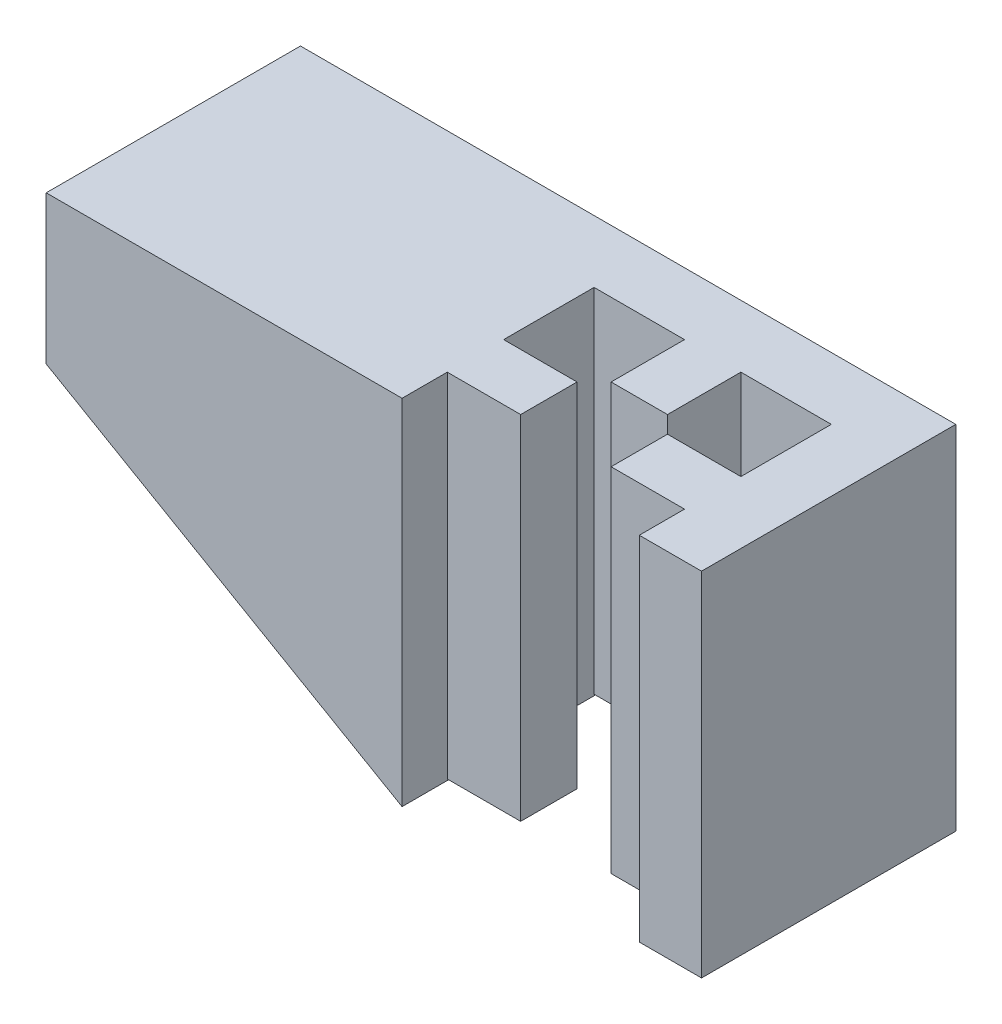
ISO-10303-21;
HEADER;
FILE_DESCRIPTION(('STEP AP214'),'2;1');
FILE_NAME('part.step','',(''),(''),'','','');
FILE_SCHEMA(('AUTOMOTIVE_DESIGN { 1 0 10303 214 1 1 1 1 }'));
ENDSEC;
DATA;
#1=APPLICATION_CONTEXT('core data for automotive mechanical design processes');
#2=APPLICATION_PROTOCOL_DEFINITION('international standard','automotive_design',2000,#1);
#3=PRODUCT_CONTEXT('',#1,'mechanical');
#4=PRODUCT('Part','Part','',(#3));
#5=PRODUCT_RELATED_PRODUCT_CATEGORY('part','',(#4));
#6=PRODUCT_DEFINITION_FORMATION('','',#4);
#7=PRODUCT_DEFINITION_CONTEXT('part definition',#1,'design');
#8=PRODUCT_DEFINITION('design','',#6,#7);
#9=PRODUCT_DEFINITION_SHAPE('','',#8);
#10=(LENGTH_UNIT() NAMED_UNIT(*) SI_UNIT(.MILLI.,.METRE.));
#11=(NAMED_UNIT(*) PLANE_ANGLE_UNIT() SI_UNIT($,.RADIAN.));
#12=(NAMED_UNIT(*) SI_UNIT($,.STERADIAN.) SOLID_ANGLE_UNIT());
#13=UNCERTAINTY_MEASURE_WITH_UNIT(LENGTH_MEASURE(1.E-05),#10,'distance_accuracy_value','');
#14=(GEOMETRIC_REPRESENTATION_CONTEXT(3) GLOBAL_UNCERTAINTY_ASSIGNED_CONTEXT((#13)) GLOBAL_UNIT_ASSIGNED_CONTEXT((#10,
#11,#12)) REPRESENTATION_CONTEXT('',''));
#15=CARTESIAN_POINT('',(0.,0.,0.));
#16=DIRECTION('',(0.,0.,1.));
#17=DIRECTION('',(1.,0.,0.));
#18=AXIS2_PLACEMENT_3D('',#15,#16,#17);
#19=CARTESIAN_POINT('',(-15.4,15.,-15.4));
#20=DIRECTION('',(0.,0.,1.));
#21=DIRECTION('',(1.,0.,0.));
#22=AXIS2_PLACEMENT_3D('',#19,#20,#21);
#23=PLANE('',#22);
#24=DIRECTION('',(0.866025403784436,-0.500000000000004,0.));
#25=VECTOR('',#24,1.);
#26=CARTESIAN_POINT('',(-27.1153998019124,-5.29166768789439,-15.4));
#27=LINE('',#26,#25);
#28=CARTESIAN_POINT('',(-40.4,2.37819981254814,-15.4));
#29=VERTEX_POINT('',#28);
#30=CARTESIAN_POINT('',(-10.1,-15.1155133438977,-15.4));
#31=VERTEX_POINT('',#30);
#32=EDGE_CURVE('E48',#29,#31,#27,.T.);
#33=ORIENTED_EDGE('',*,*,#32,.F.);
#34=DIRECTION('',(0.,-1.,0.));
#35=VECTOR('',#34,1.);
#36=CARTESIAN_POINT('',(-40.4,15.,-15.4));
#37=LINE('',#36,#35);
#38=CARTESIAN_POINT('',(-40.4,15.,-15.4));
#39=VERTEX_POINT('',#38);
#40=EDGE_CURVE('E205',#39,#29,#37,.T.);
#41=ORIENTED_EDGE('',*,*,#40,.F.);
#42=DIRECTION('',(-1.,0.,0.));
#43=VECTOR('',#42,1.);
#44=CARTESIAN_POINT('',(-15.4,15.,-15.4));
#45=LINE('',#44,#43);
#46=CARTESIAN_POINT('',(15.4,15.,-15.4));
#47=VERTEX_POINT('',#46);
#48=EDGE_CURVE('E247',#47,#39,#45,.T.);
#49=ORIENTED_EDGE('',*,*,#48,.F.);
#50=DIRECTION('',(0.,-1.,0.));
#51=VECTOR('',#50,1.);
#52=CARTESIAN_POINT('',(15.4,15.,-15.4));
#53=LINE('',#52,#51);
#54=CARTESIAN_POINT('',(15.4,-15.,-15.4));
#55=VERTEX_POINT('',#54);
#56=EDGE_CURVE('E291',#47,#55,#53,.T.);
#57=ORIENTED_EDGE('',*,*,#56,.T.);
#58=DIRECTION('',(-1.,0.,0.));
#59=VECTOR('',#58,1.);
#60=CARTESIAN_POINT('',(-15.4,-15.,-15.4));
#61=LINE('',#60,#59);
#62=CARTESIAN_POINT('',(-10.1,-15.,-15.4));
#63=VERTEX_POINT('',#62);
#64=EDGE_CURVE('E217',#55,#63,#61,.T.);
#65=ORIENTED_EDGE('',*,*,#64,.T.);
#66=DIRECTION('',(0.,1.,0.));
#67=VECTOR('',#66,1.);
#68=CARTESIAN_POINT('',(-10.1,-40.,-15.4));
#69=LINE('',#68,#67);
#70=EDGE_CURVE('E203',#31,#63,#69,.T.);
#71=ORIENTED_EDGE('',*,*,#70,.F.);
#72=EDGE_LOOP('',(#33,#41,#49,#57,#65,#71));
#73=FACE_BOUND('',#72,.T.);
#74=ADVANCED_FACE('F33',(#73),#23,.F.);
#75=CARTESIAN_POINT('',(-10.1,15.,6.25));
#76=DIRECTION('',(0.,0.,-1.));
#77=DIRECTION('',(-1.,0.,0.));
#78=AXIS2_PLACEMENT_3D('',#75,#76,#77);
#79=PLANE('',#78);
#80=DIRECTION('',(-0.866025403784436,0.500000000000004,0.));
#81=VECTOR('',#80,1.);
#82=CARTESIAN_POINT('',(-23.1403998019124,-7.58663500792316,6.25));
#83=LINE('',#82,#81);
#84=CARTESIAN_POINT('',(-10.1,-15.1155133438977,6.25));
#85=VERTEX_POINT('',#84);
#86=CARTESIAN_POINT('',(-40.4,2.37819981254814,6.25000000000001));
#87=VERTEX_POINT('',#86);
#88=EDGE_CURVE('E11',#85,#87,#83,.T.);
#89=ORIENTED_EDGE('',*,*,#88,.F.);
#90=DIRECTION('',(0.,-1.,0.));
#91=VECTOR('',#90,1.);
#92=CARTESIAN_POINT('',(-10.1,15.,6.25));
#93=LINE('',#92,#91);
#94=CARTESIAN_POINT('',(-10.1,15.,6.25));
#95=VERTEX_POINT('',#94);
#96=EDGE_CURVE('E289',#95,#85,#93,.T.);
#97=ORIENTED_EDGE('',*,*,#96,.F.);
#98=DIRECTION('',(1.,0.,0.));
#99=VECTOR('',#98,1.);
#100=CARTESIAN_POINT('',(-10.1,15.,6.25));
#101=LINE('',#100,#99);
#102=CARTESIAN_POINT('',(-40.4,15.,6.25));
#103=VERTEX_POINT('',#102);
#104=EDGE_CURVE('E249',#103,#95,#101,.T.);
#105=ORIENTED_EDGE('',*,*,#104,.F.);
#106=DIRECTION('',(0.,1.,0.));
#107=VECTOR('',#106,1.);
#108=CARTESIAN_POINT('',(-40.4,15.,6.25));
#109=LINE('',#108,#107);
#110=EDGE_CURVE('E207',#87,#103,#109,.T.);
#111=ORIENTED_EDGE('',*,*,#110,.F.);
#112=EDGE_LOOP('',(#89,#97,#105,#111));
#113=FACE_BOUND('',#112,.T.);
#114=ADVANCED_FACE('F440',(#113),#79,.F.);
#115=CARTESIAN_POINT('',(0.,-15.,0.));
#116=DIRECTION('',(0.,1.,0.));
#117=DIRECTION('',(0.,0.,1.));
#118=AXIS2_PLACEMENT_3D('',#115,#116,#117);
#119=PLANE('',#118);
#120=DIRECTION('',(0.,0.,1.));
#121=VECTOR('',#120,1.);
#122=CARTESIAN_POINT('',(-10.1,-15.,6.25));
#123=LINE('',#122,#121);
#124=CARTESIAN_POINT('',(-10.1,-15.,-10.1));
#125=VERTEX_POINT('',#124);
#126=EDGE_CURVE('E201',#63,#125,#123,.T.);
#127=ORIENTED_EDGE('',*,*,#126,.F.);
#128=ORIENTED_EDGE('',*,*,#64,.F.);
#129=DIRECTION('',(0.,0.,-1.));
#130=VECTOR('',#129,1.);
#131=CARTESIAN_POINT('',(15.4,-15.,-15.4));
#132=LINE('',#131,#130);
#133=CARTESIAN_POINT('',(15.4,-15.,6.25));
#134=VERTEX_POINT('',#133);
#135=EDGE_CURVE('E283',#134,#55,#132,.T.);
#136=ORIENTED_EDGE('',*,*,#135,.F.);
#137=DIRECTION('',(1.,0.,0.));
#138=VECTOR('',#137,1.);
#139=CARTESIAN_POINT('',(10.1,-15.,6.25));
#140=LINE('',#139,#138);
#141=CARTESIAN_POINT('',(10.1,-15.,6.25));
#142=VERTEX_POINT('',#141);
#143=EDGE_CURVE('E281',#142,#134,#140,.T.);
#144=ORIENTED_EDGE('',*,*,#143,.F.);
#145=DIRECTION('',(0.,0.,1.));
#146=VECTOR('',#145,1.);
#147=CARTESIAN_POINT('',(10.1,-15.,2.4));
#148=LINE('',#147,#146);
#149=CARTESIAN_POINT('',(10.1,-15.,2.4));
#150=VERTEX_POINT('',#149);
#151=EDGE_CURVE('E279',#150,#142,#148,.T.);
#152=ORIENTED_EDGE('',*,*,#151,.F.);
#153=DIRECTION('',(1.,0.,0.));
#154=VECTOR('',#153,1.);
#155=CARTESIAN_POINT('',(3.85,-15.,2.4));
#156=LINE('',#155,#154);
#157=CARTESIAN_POINT('',(3.85,-15.,2.4));
#158=VERTEX_POINT('',#157);
#159=EDGE_CURVE('E277',#158,#150,#156,.T.);
#160=ORIENTED_EDGE('',*,*,#159,.F.);
#161=DIRECTION('',(0.,0.,1.));
#162=VECTOR('',#161,1.);
#163=CARTESIAN_POINT('',(3.85,-15.,2.4));
#164=LINE('',#163,#162);
#165=CARTESIAN_POINT('',(3.85,-15.,-2.4));
#166=VERTEX_POINT('',#165);
#167=EDGE_CURVE('E275',#166,#158,#164,.T.);
#168=ORIENTED_EDGE('',*,*,#167,.F.);
#169=DIRECTION('',(-1.,0.,0.));
#170=VECTOR('',#169,1.);
#171=CARTESIAN_POINT('',(3.85,-15.,-2.4));
#172=LINE('',#171,#170);
#173=CARTESIAN_POINT('',(10.1,-15.,-2.4));
#174=VERTEX_POINT('',#173);
#175=EDGE_CURVE('E273',#174,#166,#172,.T.);
#176=ORIENTED_EDGE('',*,*,#175,.F.);
#177=DIRECTION('',(0.,0.,1.));
#178=VECTOR('',#177,1.);
#179=CARTESIAN_POINT('',(10.1,-15.,-2.4));
#180=LINE('',#179,#178);
#181=CARTESIAN_POINT('',(10.1,-15.,-10.1));
#182=VERTEX_POINT('',#181);
#183=EDGE_CURVE('E271',#182,#174,#180,.T.);
#184=ORIENTED_EDGE('',*,*,#183,.F.);
#185=DIRECTION('',(1.,0.,0.));
#186=VECTOR('',#185,1.);
#187=CARTESIAN_POINT('',(10.1,-15.,-10.1));
#188=LINE('',#187,#186);
#189=CARTESIAN_POINT('',(2.4,-15.,-10.1));
#190=VERTEX_POINT('',#189);
#191=EDGE_CURVE('E269',#190,#182,#188,.T.);
#192=ORIENTED_EDGE('',*,*,#191,.F.);
#193=DIRECTION('',(0.,0.,-1.));
#194=VECTOR('',#193,1.);
#195=CARTESIAN_POINT('',(2.4,-15.,-10.1));
#196=LINE('',#195,#194);
#197=CARTESIAN_POINT('',(2.4,-15.,-3.85));
#198=VERTEX_POINT('',#197);
#199=EDGE_CURVE('E267',#198,#190,#196,.T.);
#200=ORIENTED_EDGE('',*,*,#199,.F.);
#201=DIRECTION('',(1.,0.,0.));
#202=VECTOR('',#201,1.);
#203=CARTESIAN_POINT('',(-2.4,-15.,-3.85));
#204=LINE('',#203,#202);
#205=CARTESIAN_POINT('',(-2.4,-15.,-3.85));
#206=VERTEX_POINT('',#205);
#207=EDGE_CURVE('E265',#206,#198,#204,.T.);
#208=ORIENTED_EDGE('',*,*,#207,.F.);
#209=DIRECTION('',(0.,0.,1.));
#210=VECTOR('',#209,1.);
#211=CARTESIAN_POINT('',(-2.4,-15.,-10.1));
#212=LINE('',#211,#210);
#213=CARTESIAN_POINT('',(-2.4,-15.,-10.1));
#214=VERTEX_POINT('',#213);
#215=EDGE_CURVE('E263',#214,#206,#212,.T.);
#216=ORIENTED_EDGE('',*,*,#215,.F.);
#217=DIRECTION('',(1.,0.,0.));
#218=VECTOR('',#217,1.);
#219=CARTESIAN_POINT('',(-10.1,-15.,-10.1));
#220=LINE('',#219,#218);
#221=EDGE_CURVE('E261',#125,#214,#220,.T.);
#222=ORIENTED_EDGE('',*,*,#221,.F.);
#223=EDGE_LOOP('',(#127,#128,#136,#144,#152,#160,#168,#176,#184,#192,#200,#208,#216,#222));
#224=FACE_BOUND('',#223,.T.);
#225=ADVANCED_FACE('F378',(#224),#119,.F.);
#226=CARTESIAN_POINT('',(-10.1,-15.,-2.4));
#227=VERTEX_POINT('',#226);
#228=CARTESIAN_POINT('',(-10.1,-15.,2.4));
#229=VERTEX_POINT('',#228);
#230=EDGE_CURVE('E41',#227,#229,#123,.T.);
#231=ORIENTED_EDGE('',*,*,#230,.F.);
#232=DIRECTION('',(-1.,0.,0.));
#233=VECTOR('',#232,1.);
#234=CARTESIAN_POINT('',(-3.85,-15.,-2.4));
#235=LINE('',#234,#233);
#236=CARTESIAN_POINT('',(-3.85,-15.,-2.4));
#237=VERTEX_POINT('',#236);
#238=EDGE_CURVE('E258',#237,#227,#235,.T.);
#239=ORIENTED_EDGE('',*,*,#238,.F.);
#240=DIRECTION('',(0.,0.,-1.));
#241=VECTOR('',#240,1.);
#242=CARTESIAN_POINT('',(-3.85,-15.,2.4));
#243=LINE('',#242,#241);
#244=CARTESIAN_POINT('',(-3.85,-15.,2.4));
#245=VERTEX_POINT('',#244);
#246=EDGE_CURVE('E256',#245,#237,#243,.T.);
#247=ORIENTED_EDGE('',*,*,#246,.F.);
#248=DIRECTION('',(1.,0.,0.));
#249=VECTOR('',#248,1.);
#250=CARTESIAN_POINT('',(-3.85,-15.,2.4));
#251=LINE('',#250,#249);
#252=EDGE_CURVE('E212',#229,#245,#251,.T.);
#253=ORIENTED_EDGE('',*,*,#252,.F.);
#254=EDGE_LOOP('',(#231,#239,#247,#253));
#255=FACE_BOUND('',#254,.T.);
#256=ADVANCED_FACE('F349',(#255),#119,.F.);
#257=CARTESIAN_POINT('',(-3.85,15.,2.4));
#258=DIRECTION('',(0.,0.,-1.));
#259=DIRECTION('',(-1.,0.,0.));
#260=AXIS2_PLACEMENT_3D('',#257,#258,#259);
#261=PLANE('',#260);
#262=ORIENTED_EDGE('',*,*,#252,.T.);
#263=DIRECTION('',(0.,-1.,0.));
#264=VECTOR('',#263,1.);
#265=CARTESIAN_POINT('',(-3.85,15.,2.4));
#266=LINE('',#265,#264);
#267=CARTESIAN_POINT('',(-3.85,15.,2.4));
#268=VERTEX_POINT('',#267);
#269=EDGE_CURVE('E335',#268,#245,#266,.T.);
#270=ORIENTED_EDGE('',*,*,#269,.F.);
#271=DIRECTION('',(1.,0.,0.));
#272=VECTOR('',#271,1.);
#273=CARTESIAN_POINT('',(-3.85,15.,2.4));
#274=LINE('',#273,#272);
#275=CARTESIAN_POINT('',(-10.1,15.,2.4));
#276=VERTEX_POINT('',#275);
#277=EDGE_CURVE('E213',#276,#268,#274,.T.);
#278=ORIENTED_EDGE('',*,*,#277,.F.);
#279=DIRECTION('',(0.,-1.,0.));
#280=VECTOR('',#279,1.);
#281=CARTESIAN_POINT('',(-10.1,15.,2.4));
#282=LINE('',#281,#280);
#283=EDGE_CURVE('E253',#276,#229,#282,.T.);
#284=ORIENTED_EDGE('',*,*,#283,.T.);
#285=EDGE_LOOP('',(#262,#270,#278,#284));
#286=FACE_BOUND('',#285,.T.);
#287=ADVANCED_FACE('F35',(#286),#261,.F.);
#288=CARTESIAN_POINT('',(-3.85,15.,2.4));
#289=DIRECTION('',(-1.,0.,0.));
#290=DIRECTION('',(0.,0.,1.));
#291=AXIS2_PLACEMENT_3D('',#288,#289,#290);
#292=PLANE('',#291);
#293=ORIENTED_EDGE('',*,*,#246,.T.);
#294=DIRECTION('',(0.,-1.,0.));
#295=VECTOR('',#294,1.);
#296=CARTESIAN_POINT('',(-3.85,15.,-2.4));
#297=LINE('',#296,#295);
#298=CARTESIAN_POINT('',(-3.85,15.,-2.4));
#299=VERTEX_POINT('',#298);
#300=EDGE_CURVE('E333',#299,#237,#297,.T.);
#301=ORIENTED_EDGE('',*,*,#300,.F.);
#302=DIRECTION('',(0.,0.,-1.));
#303=VECTOR('',#302,1.);
#304=CARTESIAN_POINT('',(-3.85,15.,2.4));
#305=LINE('',#304,#303);
#306=EDGE_CURVE('E216',#268,#299,#305,.T.);
#307=ORIENTED_EDGE('',*,*,#306,.F.);
#308=ORIENTED_EDGE('',*,*,#269,.T.);
#309=EDGE_LOOP('',(#293,#301,#307,#308));
#310=FACE_BOUND('',#309,.T.);
#311=ADVANCED_FACE('F351',(#310),#292,.F.);
#312=CARTESIAN_POINT('',(-3.85,15.,-2.4));
#313=DIRECTION('',(0.,0.,1.));
#314=DIRECTION('',(1.,0.,0.));
#315=AXIS2_PLACEMENT_3D('',#312,#313,#314);
#316=PLANE('',#315);
#317=ORIENTED_EDGE('',*,*,#238,.T.);
#318=DIRECTION('',(0.,-1.,0.));
#319=VECTOR('',#318,1.);
#320=CARTESIAN_POINT('',(-10.1,15.,-2.4));
#321=LINE('',#320,#319);
#322=CARTESIAN_POINT('',(-10.1,15.,-2.4));
#323=VERTEX_POINT('',#322);
#324=EDGE_CURVE('E330',#323,#227,#321,.T.);
#325=ORIENTED_EDGE('',*,*,#324,.F.);
#326=DIRECTION('',(-1.,0.,0.));
#327=VECTOR('',#326,1.);
#328=CARTESIAN_POINT('',(-3.85,15.,-2.4));
#329=LINE('',#328,#327);
#330=EDGE_CURVE('E219',#299,#323,#329,.T.);
#331=ORIENTED_EDGE('',*,*,#330,.F.);
#332=ORIENTED_EDGE('',*,*,#300,.T.);
#333=EDGE_LOOP('',(#317,#325,#331,#332));
#334=FACE_BOUND('',#333,.T.);
#335=ADVANCED_FACE('F354',(#334),#316,.F.);
#336=CARTESIAN_POINT('',(-10.1,15.,-10.1));
#337=DIRECTION('',(0.,0.,-1.));
#338=DIRECTION('',(-1.,0.,0.));
#339=AXIS2_PLACEMENT_3D('',#336,#337,#338);
#340=PLANE('',#339);
#341=ORIENTED_EDGE('',*,*,#221,.T.);
#342=DIRECTION('',(0.,-1.,0.));
#343=VECTOR('',#342,1.);
#344=CARTESIAN_POINT('',(-2.4,15.,-10.1));
#345=LINE('',#344,#343);
#346=CARTESIAN_POINT('',(-2.4,15.,-10.1));
#347=VERTEX_POINT('',#346);
#348=EDGE_CURVE('E324',#347,#214,#345,.T.);
#349=ORIENTED_EDGE('',*,*,#348,.F.);
#350=DIRECTION('',(1.,0.,0.));
#351=VECTOR('',#350,1.);
#352=CARTESIAN_POINT('',(-10.1,15.,-10.1));
#353=LINE('',#352,#351);
#354=CARTESIAN_POINT('',(-10.1,15.,-10.1));
#355=VERTEX_POINT('',#354);
#356=EDGE_CURVE('E223',#355,#347,#353,.T.);
#357=ORIENTED_EDGE('',*,*,#356,.F.);
#358=DIRECTION('',(0.,-1.,0.));
#359=VECTOR('',#358,1.);
#360=CARTESIAN_POINT('',(-10.1,15.,-10.1));
#361=LINE('',#360,#359);
#362=EDGE_CURVE('E327',#355,#125,#361,.T.);
#363=ORIENTED_EDGE('',*,*,#362,.T.);
#364=EDGE_LOOP('',(#341,#349,#357,#363));
#365=FACE_BOUND('',#364,.T.);
#366=ADVANCED_FACE('F383',(#365),#340,.F.);
#367=CARTESIAN_POINT('',(-2.4,15.,-10.1));
#368=DIRECTION('',(1.,0.,0.));
#369=DIRECTION('',(0.,0.,-1.));
#370=AXIS2_PLACEMENT_3D('',#367,#368,#369);
#371=PLANE('',#370);
#372=ORIENTED_EDGE('',*,*,#215,.T.);
#373=DIRECTION('',(0.,-1.,0.));
#374=VECTOR('',#373,1.);
#375=CARTESIAN_POINT('',(-2.4,15.,-3.85));
#376=LINE('',#375,#374);
#377=CARTESIAN_POINT('',(-2.4,15.,-3.85));
#378=VERTEX_POINT('',#377);
#379=EDGE_CURVE('E321',#378,#206,#376,.T.);
#380=ORIENTED_EDGE('',*,*,#379,.F.);
#381=DIRECTION('',(0.,0.,1.));
#382=VECTOR('',#381,1.);
#383=CARTESIAN_POINT('',(-2.4,15.,-10.1));
#384=LINE('',#383,#382);
#385=EDGE_CURVE('E225',#347,#378,#384,.T.);
#386=ORIENTED_EDGE('',*,*,#385,.F.);
#387=ORIENTED_EDGE('',*,*,#348,.T.);
#388=EDGE_LOOP('',(#372,#380,#386,#387));
#389=FACE_BOUND('',#388,.T.);
#390=ADVANCED_FACE('F390',(#389),#371,.F.);
#391=CARTESIAN_POINT('',(-2.4,15.,-3.85));
#392=DIRECTION('',(0.,0.,-1.));
#393=DIRECTION('',(-1.,0.,0.));
#394=AXIS2_PLACEMENT_3D('',#391,#392,#393);
#395=PLANE('',#394);
#396=ORIENTED_EDGE('',*,*,#207,.T.);
#397=DIRECTION('',(0.,-1.,0.));
#398=VECTOR('',#397,1.);
#399=CARTESIAN_POINT('',(2.4,15.,-3.85));
#400=LINE('',#399,#398);
#401=CARTESIAN_POINT('',(2.4,15.,-3.85));
#402=VERTEX_POINT('',#401);
#403=EDGE_CURVE('E318',#402,#198,#400,.T.);
#404=ORIENTED_EDGE('',*,*,#403,.F.);
#405=DIRECTION('',(1.,0.,0.));
#406=VECTOR('',#405,1.);
#407=CARTESIAN_POINT('',(-2.4,15.,-3.85));
#408=LINE('',#407,#406);
#409=EDGE_CURVE('E227',#378,#402,#408,.T.);
#410=ORIENTED_EDGE('',*,*,#409,.F.);
#411=ORIENTED_EDGE('',*,*,#379,.T.);
#412=EDGE_LOOP('',(#396,#404,#410,#411));
#413=FACE_BOUND('',#412,.T.);
#414=ADVANCED_FACE('F394',(#413),#395,.F.);
#415=CARTESIAN_POINT('',(2.4,15.,-10.1));
#416=DIRECTION('',(-1.,0.,0.));
#417=DIRECTION('',(0.,0.,1.));
#418=AXIS2_PLACEMENT_3D('',#415,#416,#417);
#419=PLANE('',#418);
#420=ORIENTED_EDGE('',*,*,#199,.T.);
#421=DIRECTION('',(0.,-1.,0.));
#422=VECTOR('',#421,1.);
#423=CARTESIAN_POINT('',(2.4,15.,-10.1));
#424=LINE('',#423,#422);
#425=CARTESIAN_POINT('',(2.4,15.,-10.1));
#426=VERTEX_POINT('',#425);
#427=EDGE_CURVE('E315',#426,#190,#424,.T.);
#428=ORIENTED_EDGE('',*,*,#427,.F.);
#429=DIRECTION('',(0.,0.,-1.));
#430=VECTOR('',#429,1.);
#431=CARTESIAN_POINT('',(2.4,15.,-10.1));
#432=LINE('',#431,#430);
#433=EDGE_CURVE('E229',#402,#426,#432,.T.);
#434=ORIENTED_EDGE('',*,*,#433,.F.);
#435=ORIENTED_EDGE('',*,*,#403,.T.);
#436=EDGE_LOOP('',(#420,#428,#434,#435));
#437=FACE_BOUND('',#436,.T.);
#438=ADVANCED_FACE('F401',(#437),#419,.F.);
#439=CARTESIAN_POINT('',(10.1,15.,-10.1));
#440=DIRECTION('',(0.,0.,-1.));
#441=DIRECTION('',(-1.,0.,0.));
#442=AXIS2_PLACEMENT_3D('',#439,#440,#441);
#443=PLANE('',#442);
#444=ORIENTED_EDGE('',*,*,#191,.T.);
#445=DIRECTION('',(0.,-1.,0.));
#446=VECTOR('',#445,1.);
#447=CARTESIAN_POINT('',(10.1,15.,-10.1));
#448=LINE('',#447,#446);
#449=CARTESIAN_POINT('',(10.1,15.,-10.1));
#450=VERTEX_POINT('',#449);
#451=EDGE_CURVE('E312',#450,#182,#448,.T.);
#452=ORIENTED_EDGE('',*,*,#451,.F.);
#453=DIRECTION('',(1.,0.,0.));
#454=VECTOR('',#453,1.);
#455=CARTESIAN_POINT('',(10.1,15.,-10.1));
#456=LINE('',#455,#454);
#457=EDGE_CURVE('E231',#426,#450,#456,.T.);
#458=ORIENTED_EDGE('',*,*,#457,.F.);
#459=ORIENTED_EDGE('',*,*,#427,.T.);
#460=EDGE_LOOP('',(#444,#452,#458,#459));
#461=FACE_BOUND('',#460,.T.);
#462=ADVANCED_FACE('F404',(#461),#443,.F.);
#463=CARTESIAN_POINT('',(10.1,15.,-2.4));
#464=DIRECTION('',(1.,0.,0.));
#465=DIRECTION('',(0.,0.,-1.));
#466=AXIS2_PLACEMENT_3D('',#463,#464,#465);
#467=PLANE('',#466);
#468=ORIENTED_EDGE('',*,*,#183,.T.);
#469=DIRECTION('',(0.,-1.,0.));
#470=VECTOR('',#469,1.);
#471=CARTESIAN_POINT('',(10.1,15.,-2.4));
#472=LINE('',#471,#470);
#473=CARTESIAN_POINT('',(10.1,15.,-2.4));
#474=VERTEX_POINT('',#473);
#475=EDGE_CURVE('E309',#474,#174,#472,.T.);
#476=ORIENTED_EDGE('',*,*,#475,.F.);
#477=DIRECTION('',(0.,0.,1.));
#478=VECTOR('',#477,1.);
#479=CARTESIAN_POINT('',(10.1,15.,-2.4));
#480=LINE('',#479,#478);
#481=EDGE_CURVE('E233',#450,#474,#480,.T.);
#482=ORIENTED_EDGE('',*,*,#481,.F.);
#483=ORIENTED_EDGE('',*,*,#451,.T.);
#484=EDGE_LOOP('',(#468,#476,#482,#483));
#485=FACE_BOUND('',#484,.T.);
#486=ADVANCED_FACE('F409',(#485),#467,.F.);
#487=CARTESIAN_POINT('',(3.85,15.,-2.4));
#488=DIRECTION('',(0.,0.,1.));
#489=DIRECTION('',(1.,0.,0.));
#490=AXIS2_PLACEMENT_3D('',#487,#488,#489);
#491=PLANE('',#490);
#492=ORIENTED_EDGE('',*,*,#175,.T.);
#493=DIRECTION('',(0.,-1.,0.));
#494=VECTOR('',#493,1.);
#495=CARTESIAN_POINT('',(3.85,15.,-2.4));
#496=LINE('',#495,#494);
#497=CARTESIAN_POINT('',(3.85,15.,-2.4));
#498=VERTEX_POINT('',#497);
#499=EDGE_CURVE('E306',#498,#166,#496,.T.);
#500=ORIENTED_EDGE('',*,*,#499,.F.);
#501=DIRECTION('',(-1.,0.,0.));
#502=VECTOR('',#501,1.);
#503=CARTESIAN_POINT('',(3.85,15.,-2.4));
#504=LINE('',#503,#502);
#505=EDGE_CURVE('E235',#474,#498,#504,.T.);
#506=ORIENTED_EDGE('',*,*,#505,.F.);
#507=ORIENTED_EDGE('',*,*,#475,.T.);
#508=EDGE_LOOP('',(#492,#500,#506,#507));
#509=FACE_BOUND('',#508,.T.);
#510=ADVANCED_FACE('F415',(#509),#491,.F.);
#511=CARTESIAN_POINT('',(3.85,15.,2.4));
#512=DIRECTION('',(1.,0.,0.));
#513=DIRECTION('',(0.,0.,-1.));
#514=AXIS2_PLACEMENT_3D('',#511,#512,#513);
#515=PLANE('',#514);
#516=ORIENTED_EDGE('',*,*,#167,.T.);
#517=DIRECTION('',(0.,-1.,0.));
#518=VECTOR('',#517,1.);
#519=CARTESIAN_POINT('',(3.85,15.,2.4));
#520=LINE('',#519,#518);
#521=CARTESIAN_POINT('',(3.85,15.,2.4));
#522=VERTEX_POINT('',#521);
#523=EDGE_CURVE('E303',#522,#158,#520,.T.);
#524=ORIENTED_EDGE('',*,*,#523,.F.);
#525=DIRECTION('',(0.,0.,1.));
#526=VECTOR('',#525,1.);
#527=CARTESIAN_POINT('',(3.85,15.,2.4));
#528=LINE('',#527,#526);
#529=EDGE_CURVE('E237',#498,#522,#528,.T.);
#530=ORIENTED_EDGE('',*,*,#529,.F.);
#531=ORIENTED_EDGE('',*,*,#499,.T.);
#532=EDGE_LOOP('',(#516,#524,#530,#531));
#533=FACE_BOUND('',#532,.T.);
#534=ADVANCED_FACE('F419',(#533),#515,.F.);
#535=CARTESIAN_POINT('',(3.85,15.,2.4));
#536=DIRECTION('',(0.,0.,-1.));
#537=DIRECTION('',(-1.,0.,0.));
#538=AXIS2_PLACEMENT_3D('',#535,#536,#537);
#539=PLANE('',#538);
#540=ORIENTED_EDGE('',*,*,#159,.T.);
#541=DIRECTION('',(0.,-1.,0.));
#542=VECTOR('',#541,1.);
#543=CARTESIAN_POINT('',(10.1,15.,2.4));
#544=LINE('',#543,#542);
#545=CARTESIAN_POINT('',(10.1,15.,2.4));
#546=VERTEX_POINT('',#545);
#547=EDGE_CURVE('E300',#546,#150,#544,.T.);
#548=ORIENTED_EDGE('',*,*,#547,.F.);
#549=DIRECTION('',(1.,0.,0.));
#550=VECTOR('',#549,1.);
#551=CARTESIAN_POINT('',(3.85,15.,2.4));
#552=LINE('',#551,#550);
#553=EDGE_CURVE('E239',#522,#546,#552,.T.);
#554=ORIENTED_EDGE('',*,*,#553,.F.);
#555=ORIENTED_EDGE('',*,*,#523,.T.);
#556=EDGE_LOOP('',(#540,#548,#554,#555));
#557=FACE_BOUND('',#556,.T.);
#558=ADVANCED_FACE('F424',(#557),#539,.F.);
#559=CARTESIAN_POINT('',(10.1,15.,2.4));
#560=DIRECTION('',(1.,0.,0.));
#561=DIRECTION('',(0.,0.,-1.));
#562=AXIS2_PLACEMENT_3D('',#559,#560,#561);
#563=PLANE('',#562);
#564=ORIENTED_EDGE('',*,*,#151,.T.);
#565=DIRECTION('',(0.,-1.,0.));
#566=VECTOR('',#565,1.);
#567=CARTESIAN_POINT('',(10.1,15.,6.25));
#568=LINE('',#567,#566);
#569=CARTESIAN_POINT('',(10.1,15.,6.25));
#570=VERTEX_POINT('',#569);
#571=EDGE_CURVE('E297',#570,#142,#568,.T.);
#572=ORIENTED_EDGE('',*,*,#571,.F.);
#573=DIRECTION('',(0.,0.,1.));
#574=VECTOR('',#573,1.);
#575=CARTESIAN_POINT('',(10.1,15.,2.4));
#576=LINE('',#575,#574);
#577=EDGE_CURVE('E241',#546,#570,#576,.T.);
#578=ORIENTED_EDGE('',*,*,#577,.F.);
#579=ORIENTED_EDGE('',*,*,#547,.T.);
#580=EDGE_LOOP('',(#564,#572,#578,#579));
#581=FACE_BOUND('',#580,.T.);
#582=ADVANCED_FACE('F428',(#581),#563,.F.);
#583=CARTESIAN_POINT('',(10.1,15.,6.25));
#584=DIRECTION('',(0.,0.,-1.));
#585=DIRECTION('',(-1.,0.,0.));
#586=AXIS2_PLACEMENT_3D('',#583,#584,#585);
#587=PLANE('',#586);
#588=ORIENTED_EDGE('',*,*,#143,.T.);
#589=DIRECTION('',(0.,-1.,0.));
#590=VECTOR('',#589,1.);
#591=CARTESIAN_POINT('',(15.4,15.,6.25));
#592=LINE('',#591,#590);
#593=CARTESIAN_POINT('',(15.4,15.,6.25));
#594=VERTEX_POINT('',#593);
#595=EDGE_CURVE('E294',#594,#134,#592,.T.);
#596=ORIENTED_EDGE('',*,*,#595,.F.);
#597=DIRECTION('',(1.,0.,0.));
#598=VECTOR('',#597,1.);
#599=CARTESIAN_POINT('',(10.1,15.,6.25));
#600=LINE('',#599,#598);
#601=EDGE_CURVE('E243',#570,#594,#600,.T.);
#602=ORIENTED_EDGE('',*,*,#601,.F.);
#603=ORIENTED_EDGE('',*,*,#571,.T.);
#604=EDGE_LOOP('',(#588,#596,#602,#603));
#605=FACE_BOUND('',#604,.T.);
#606=ADVANCED_FACE('F430',(#605),#587,.F.);
#607=CARTESIAN_POINT('',(15.4,15.,-15.4));
#608=DIRECTION('',(-1.,0.,0.));
#609=DIRECTION('',(0.,0.,1.));
#610=AXIS2_PLACEMENT_3D('',#607,#608,#609);
#611=PLANE('',#610);
#612=ORIENTED_EDGE('',*,*,#135,.T.);
#613=ORIENTED_EDGE('',*,*,#56,.F.);
#614=DIRECTION('',(0.,0.,-1.));
#615=VECTOR('',#614,1.);
#616=CARTESIAN_POINT('',(15.4,15.,-15.4));
#617=LINE('',#616,#615);
#618=EDGE_CURVE('E245',#594,#47,#617,.T.);
#619=ORIENTED_EDGE('',*,*,#618,.F.);
#620=ORIENTED_EDGE('',*,*,#595,.T.);
#621=EDGE_LOOP('',(#612,#613,#619,#620));
#622=FACE_BOUND('',#621,.T.);
#623=ADVANCED_FACE('F373',(#622),#611,.F.);
#624=CARTESIAN_POINT('',(-10.1,15.,2.4));
#625=DIRECTION('',(-1.,0.,0.));
#626=DIRECTION('',(0.,0.,1.));
#627=AXIS2_PLACEMENT_3D('',#624,#625,#626);
#628=PLANE('',#627);
#629=ORIENTED_EDGE('',*,*,#96,.T.);
#630=DIRECTION('',(0.,0.,-1.));
#631=VECTOR('',#630,1.);
#632=CARTESIAN_POINT('',(-10.1,-15.1155133438977,134.919605589373));
#633=LINE('',#632,#631);
#634=EDGE_CURVE('E56',#85,#31,#633,.T.);
#635=ORIENTED_EDGE('',*,*,#634,.T.);
#636=ORIENTED_EDGE('',*,*,#70,.T.);
#637=ORIENTED_EDGE('',*,*,#126,.T.);
#638=ORIENTED_EDGE('',*,*,#362,.F.);
#639=DIRECTION('',(0.,0.,-1.));
#640=VECTOR('',#639,1.);
#641=CARTESIAN_POINT('',(-10.1,15.,-2.4));
#642=LINE('',#641,#640);
#643=EDGE_CURVE('E221',#323,#355,#642,.T.);
#644=ORIENTED_EDGE('',*,*,#643,.F.);
#645=ORIENTED_EDGE('',*,*,#324,.T.);
#646=ORIENTED_EDGE('',*,*,#230,.T.);
#647=ORIENTED_EDGE('',*,*,#283,.F.);
#648=DIRECTION('',(0.,0.,-1.));
#649=VECTOR('',#648,1.);
#650=CARTESIAN_POINT('',(-10.1,15.,2.4));
#651=LINE('',#650,#649);
#652=EDGE_CURVE('E251',#95,#276,#651,.T.);
#653=ORIENTED_EDGE('',*,*,#652,.F.);
#654=EDGE_LOOP('',(#629,#635,#636,#637,#638,#644,#645,#646,#647,#653));
#655=FACE_BOUND('',#654,.T.);
#656=ADVANCED_FACE('F340',(#655),#628,.F.);
#657=CARTESIAN_POINT('',(0.,15.,0.));
#658=DIRECTION('',(0.,1.,0.));
#659=DIRECTION('',(0.,0.,1.));
#660=AXIS2_PLACEMENT_3D('',#657,#658,#659);
#661=PLANE('',#660);
#662=ORIENTED_EDGE('',*,*,#277,.T.);
#663=ORIENTED_EDGE('',*,*,#306,.T.);
#664=ORIENTED_EDGE('',*,*,#330,.T.);
#665=ORIENTED_EDGE('',*,*,#643,.T.);
#666=ORIENTED_EDGE('',*,*,#356,.T.);
#667=ORIENTED_EDGE('',*,*,#385,.T.);
#668=ORIENTED_EDGE('',*,*,#409,.T.);
#669=ORIENTED_EDGE('',*,*,#433,.T.);
#670=ORIENTED_EDGE('',*,*,#457,.T.);
#671=ORIENTED_EDGE('',*,*,#481,.T.);
#672=ORIENTED_EDGE('',*,*,#505,.T.);
#673=ORIENTED_EDGE('',*,*,#529,.T.);
#674=ORIENTED_EDGE('',*,*,#553,.T.);
#675=ORIENTED_EDGE('',*,*,#577,.T.);
#676=ORIENTED_EDGE('',*,*,#601,.T.);
#677=ORIENTED_EDGE('',*,*,#618,.T.);
#678=ORIENTED_EDGE('',*,*,#48,.T.);
#679=DIRECTION('',(0.,0.,-1.));
#680=VECTOR('',#679,1.);
#681=CARTESIAN_POINT('',(-40.4,15.,-15.4));
#682=LINE('',#681,#680);
#683=EDGE_CURVE('E209',#103,#39,#682,.T.);
#684=ORIENTED_EDGE('',*,*,#683,.F.);
#685=ORIENTED_EDGE('',*,*,#104,.T.);
#686=ORIENTED_EDGE('',*,*,#652,.T.);
#687=EDGE_LOOP('',(#662,#663,#664,#665,#666,#667,#668,#669,#670,#671,#672,#673,#674,#675,#676,
#677,#678,#684,#685,#686));
#688=FACE_BOUND('',#687,.T.);
#689=ADVANCED_FACE('F356',(#688),#661,.T.);
#690=CARTESIAN_POINT('',(-40.4,0.,0.));
#691=DIRECTION('',(-1.,0.,0.));
#692=DIRECTION('',(0.,0.,1.));
#693=AXIS2_PLACEMENT_3D('',#690,#691,#692);
#694=PLANE('',#693);
#695=DIRECTION('',(0.,0.,-1.));
#696=VECTOR('',#695,1.);
#697=CARTESIAN_POINT('',(-40.4,2.37819981254814,134.919605589373));
#698=LINE('',#697,#696);
#699=EDGE_CURVE('E191',#87,#29,#698,.T.);
#700=ORIENTED_EDGE('',*,*,#699,.F.);
#701=ORIENTED_EDGE('',*,*,#110,.T.);
#702=ORIENTED_EDGE('',*,*,#683,.T.);
#703=ORIENTED_EDGE('',*,*,#40,.T.);
#704=EDGE_LOOP('',(#700,#701,#702,#703));
#705=FACE_BOUND('',#704,.T.);
#706=ADVANCED_FACE('F365',(#705),#694,.T.);
#707=CARTESIAN_POINT('',(-10.1,-15.1155133438977,134.919605589373));
#708=DIRECTION('',(-0.500000000000004,-0.866025403784436,0.));
#709=DIRECTION('',(0.866025403784436,-0.500000000000004,0.));
#710=AXIS2_PLACEMENT_3D('',#707,#708,#709);
#711=PLANE('',#710);
#712=CARTESIAN_POINT('',(-24.8606868884165,-6.59342679544659,-4.44337462315339));
#713=DIRECTION('',(-0.500000000000004,-0.866025403784436,0.));
#714=DIRECTION('',(0.866025403784436,-0.500000000000004,0.));
#715=AXIS2_PLACEMENT_3D('',#712,#713,#714);
#716=CIRCLE('',#715,1.78561999999999);
#717=CARTESIAN_POINT('',(-23.3142946069109,-7.48623679544659,-4.44337462315339));
#718=VERTEX_POINT('',#717);
#719=EDGE_CURVE('E474',#718,#718,#716,.T.);
#720=ORIENTED_EDGE('',*,*,#719,.F.);
#721=EDGE_LOOP('',(#720));
#722=FACE_BOUND('',#721,.T.);
#723=ORIENTED_EDGE('',*,*,#699,.T.);
#724=ORIENTED_EDGE('',*,*,#32,.T.);
#725=ORIENTED_EDGE('',*,*,#634,.F.);
#726=ORIENTED_EDGE('',*,*,#88,.T.);
#727=EDGE_LOOP('',(#723,#724,#725,#726));
#728=FACE_BOUND('',#727,.T.);
#729=ADVANCED_FACE('F183',(#722,#728),#711,.T.);
#730=CARTESIAN_POINT('',(-18.8606868884164,3.79887804996665,-4.44337462315339));
#731=DIRECTION('',(-0.500000000000004,-0.866025403784436,0.));
#732=DIRECTION('',(0.866025403784436,-0.500000000000004,0.));
#733=AXIS2_PLACEMENT_3D('',#730,#731,#732);
#734=CONICAL_SURFACE('',#733,0.888999999999997,1.02974425867665);
#735=CARTESIAN_POINT('',(-18.5936043432587,4.26147858799468,-4.4433746231534));
#736=VERTEX_POINT('',#735);
#737=VERTEX_LOOP('',#736);
#738=FACE_BOUND('',#737,.T.);
#739=CARTESIAN_POINT('',(-18.8606868884164,3.79887804996665,-4.44337462315339));
#740=DIRECTION('',(-0.500000000000004,-0.866025403784436,0.));
#741=DIRECTION('',(0.866025403784436,-0.500000000000004,0.));
#742=AXIS2_PLACEMENT_3D('',#739,#740,#741);
#743=CIRCLE('',#742,0.888999999999997);
#744=CARTESIAN_POINT('',(-18.0907903044521,3.35437804996665,-4.44337462315339));
#745=VERTEX_POINT('',#744);
#746=EDGE_CURVE('E187',#745,#745,#743,.T.);
#747=ORIENTED_EDGE('',*,*,#746,.T.);
#748=EDGE_LOOP('',(#747));
#749=FACE_BOUND('',#748,.T.);
#750=ADVANCED_FACE('F179',(#738,#749),#734,.F.);
#751=CARTESIAN_POINT('',(-24.8606868884165,-6.59342679544659,-4.44337462315339));
#752=DIRECTION('',(-0.500000000000004,-0.866025403784436,0.));
#753=DIRECTION('',(0.866025403784436,-0.500000000000004,0.));
#754=AXIS2_PLACEMENT_3D('',#751,#752,#753);
#755=CYLINDRICAL_SURFACE('',#754,0.888999999999999);
#756=ORIENTED_EDGE('',*,*,#746,.F.);
#757=EDGE_LOOP('',(#756));
#758=FACE_BOUND('',#757,.T.);
#759=CARTESIAN_POINT('',(-24.3018868884165,-5.6255568041771,-4.44337462315339));
#760=DIRECTION('',(-0.500000000000004,-0.866025403784436,0.));
#761=DIRECTION('',(0.866025403784436,-0.500000000000004,0.));
#762=AXIS2_PLACEMENT_3D('',#759,#760,#761);
#763=CIRCLE('',#762,0.889);
#764=CARTESIAN_POINT('',(-23.5319903044521,-6.0700568041771,-4.44337462315339));
#765=VERTEX_POINT('',#764);
#766=EDGE_CURVE('E189',#765,#765,#763,.T.);
#767=ORIENTED_EDGE('',*,*,#766,.T.);
#768=EDGE_LOOP('',(#767));
#769=FACE_BOUND('',#768,.T.);
#770=ADVANCED_FACE('F182',(#758,#769),#755,.F.);
#771=CARTESIAN_POINT('',(-24.3018868884165,-5.6255568041771,-3.55437462315339));
#772=DIRECTION('',(0.500000000000004,0.866025403784436,0.));
#773=DIRECTION('',(-0.866025403784436,0.500000000000004,0.));
#774=AXIS2_PLACEMENT_3D('',#771,#772,#773);
#775=PLANE('',#774);
#776=ORIENTED_EDGE('',*,*,#766,.F.);
#777=EDGE_LOOP('',(#776));
#778=FACE_BOUND('',#777,.T.);
#779=CARTESIAN_POINT('',(-24.3018868884165,-5.6255568041771,-4.44337462315339));
#780=DIRECTION('',(-0.500000000000004,-0.866025403784436,0.));
#781=DIRECTION('',(0.866025403784436,-0.500000000000004,0.));
#782=AXIS2_PLACEMENT_3D('',#779,#780,#781);
#783=CIRCLE('',#782,1.78562);
#784=CARTESIAN_POINT('',(-22.7554946069109,-6.51836680417711,-4.44337462315339));
#785=VERTEX_POINT('',#784);
#786=EDGE_CURVE('E194',#785,#785,#783,.T.);
#787=ORIENTED_EDGE('',*,*,#786,.T.);
#788=EDGE_LOOP('',(#787));
#789=FACE_BOUND('',#788,.T.);
#790=ADVANCED_FACE('F460',(#778,#789),#775,.F.);
#791=CARTESIAN_POINT('',(-24.8606868884165,-6.59342679544659,-4.44337462315339));
#792=DIRECTION('',(-0.500000000000004,-0.866025403784436,0.));
#793=DIRECTION('',(0.866025403784436,-0.500000000000004,0.));
#794=AXIS2_PLACEMENT_3D('',#791,#792,#793);
#795=CYLINDRICAL_SURFACE('',#794,1.78562);
#796=ORIENTED_EDGE('',*,*,#786,.F.);
#797=EDGE_LOOP('',(#796));
#798=FACE_BOUND('',#797,.T.);
#799=ORIENTED_EDGE('',*,*,#719,.T.);
#800=EDGE_LOOP('',(#799));
#801=FACE_BOUND('',#800,.T.);
#802=ADVANCED_FACE('F463',(#798,#801),#795,.F.);
#803=CLOSED_SHELL('',(#74,#114,#225,#256,#287,#311,#335,#366,#390,#414,#438,#462,#486,#510,#534,
#558,#582,#606,#623,#656,#689,#706,#729,#750,#770,#790,#802));
#804=MANIFOLD_SOLID_BREP('B2',#803);
#805=ADVANCED_BREP_SHAPE_REPRESENTATION('',(#18,#804),#14);
#806=SHAPE_DEFINITION_REPRESENTATION(#9,#805);
ENDSEC;
END-ISO-10303-21;
